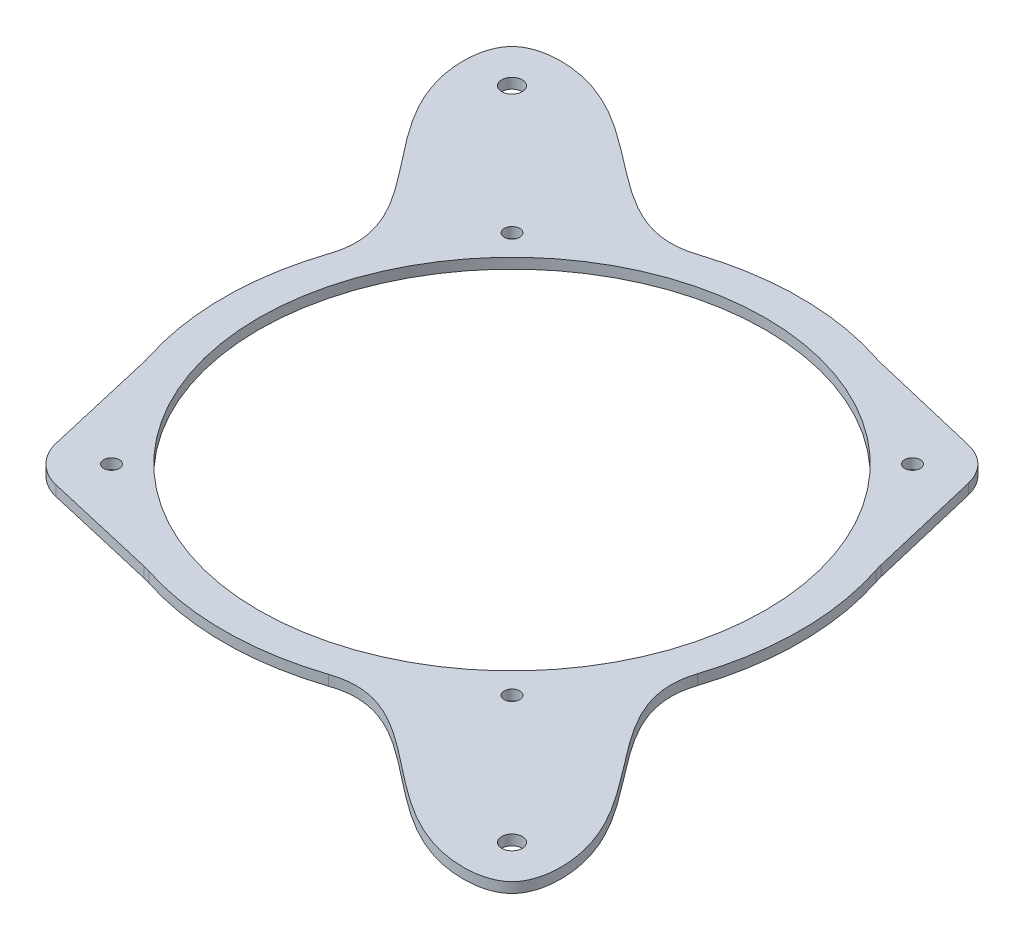
ISO-10303-21;
HEADER;
FILE_DESCRIPTION(('STEP AP214'),'2;1');
FILE_NAME('part.step','',(''),(''),'','','');
FILE_SCHEMA(('AUTOMOTIVE_DESIGN { 1 0 10303 214 1 1 1 1 }'));
ENDSEC;
DATA;
#1=APPLICATION_CONTEXT('core data for automotive mechanical design processes');
#2=APPLICATION_PROTOCOL_DEFINITION('international standard','automotive_design',2000,#1);
#3=PRODUCT_CONTEXT('',#1,'mechanical');
#4=PRODUCT('Part','Part','',(#3));
#5=PRODUCT_RELATED_PRODUCT_CATEGORY('part','',(#4));
#6=PRODUCT_DEFINITION_FORMATION('','',#4);
#7=PRODUCT_DEFINITION_CONTEXT('part definition',#1,'design');
#8=PRODUCT_DEFINITION('design','',#6,#7);
#9=PRODUCT_DEFINITION_SHAPE('','',#8);
#10=(LENGTH_UNIT() NAMED_UNIT(*) SI_UNIT(.MILLI.,.METRE.));
#11=(NAMED_UNIT(*) PLANE_ANGLE_UNIT() SI_UNIT($,.RADIAN.));
#12=(NAMED_UNIT(*) SI_UNIT($,.STERADIAN.) SOLID_ANGLE_UNIT());
#13=UNCERTAINTY_MEASURE_WITH_UNIT(LENGTH_MEASURE(1.E-05),#10,'distance_accuracy_value','');
#14=(GEOMETRIC_REPRESENTATION_CONTEXT(3) GLOBAL_UNCERTAINTY_ASSIGNED_CONTEXT((#13)) GLOBAL_UNIT_ASSIGNED_CONTEXT((#10,
#11,#12)) REPRESENTATION_CONTEXT('',''));
#15=CARTESIAN_POINT('',(0.,0.,0.));
#16=DIRECTION('',(0.,0.,1.));
#17=DIRECTION('',(1.,0.,0.));
#18=AXIS2_PLACEMENT_3D('',#15,#16,#17);
#19=CARTESIAN_POINT('',(-70.2141178406785,2.,-70.2565129555171));
#20=DIRECTION('',(0.,-1.,0.));
#21=DIRECTION('',(0.,0.,-1.));
#22=AXIS2_PLACEMENT_3D('',#19,#20,#21);
#23=PLANE('',#22);
#24=CARTESIAN_POINT('',(-17.2241664621327,2.,-53.2853459187818));
#25=CARTESIAN_POINT('',(-32.1390986115225,2.,-48.3634073784938));
#26=CARTESIAN_POINT('',(-45.2822357571774,2.,-74.6216115278217));
#27=CARTESIAN_POINT('',(-72.088250151005,2.,-72.095595619934));
#28=CARTESIAN_POINT('',(-74.6637270890297,2.,-45.2713033220915));
#29=CARTESIAN_POINT('',(-48.0069801617345,2.,-32.4894658344921));
#30=CARTESIAN_POINT('',(-53.1920044561702,2.,-17.5103015946205));
#31=B_SPLINE_CURVE_WITH_KNOTS('',3,(#24,#25,#26,#27,#28,#29,#30),.UNSPECIFIED.,.F.,.F.,(4,1,1,1,
4),(0.,0.409946781125117,0.50028408857091,0.590621396016702,1.),.UNSPECIFIED.);
#32=CARTESIAN_POINT('',(-17.224166462132,2.,-53.285345918782));
#33=VERTEX_POINT('',#32);
#34=CARTESIAN_POINT('',(-53.1920044561713,2.,-17.5103015946212));
#35=VERTEX_POINT('',#34);
#36=EDGE_CURVE('E244',#33,#35,#31,.T.);
#37=ORIENTED_EDGE('',*,*,#36,.T.);
#38=CARTESIAN_POINT('',(3.88578058618805E-13,2.,3.85108611666851E-13));
#39=DIRECTION('',(0.,1.,0.));
#40=DIRECTION('',(0.,0.,1.));
#41=AXIS2_PLACEMENT_3D('',#38,#39,#40);
#42=CIRCLE('',#41,55.9999999999999);
#43=CARTESIAN_POINT('',(-53.2853459187858,2.,17.2241664621337));
#44=VERTEX_POINT('',#43);
#45=EDGE_CURVE('E127',#35,#44,#42,.T.);
#46=ORIENTED_EDGE('',*,*,#45,.T.);
#47=CARTESIAN_POINT('',(-68.5097304670106,2.,22.145356879886));
#48=DIRECTION('',(0.,-1.,0.));
#49=DIRECTION('',(0.,0.,1.));
#50=AXIS2_PLACEMENT_3D('',#47,#48,#49);
#51=CIRCLE('',#50,16.0000000000001);
#52=CARTESIAN_POINT('',(-52.9221194930763,2.,18.5361486391101));
#53=VERTEX_POINT('',#52);
#54=EDGE_CURVE('E289',#44,#53,#51,.T.);
#55=ORIENTED_EDGE('',*,*,#54,.T.);
#56=DIRECTION('',(0.225575515048493,0.,0.974225685870891));
#57=VECTOR('',#56,1.);
#58=CARTESIAN_POINT('',(-47.7632742489976,2.,40.8164016405666));
#59=LINE('',#58,#57);
#60=CARTESIAN_POINT('',(-47.7632742489976,2.,40.8164016405666));
#61=VERTEX_POINT('',#60);
#62=EDGE_CURVE('E306',#53,#61,#59,.T.);
#63=ORIENTED_EDGE('',*,*,#62,.T.);
#64=CARTESIAN_POINT('',(-38.9952430761602,2.,38.7862220051302));
#65=DIRECTION('',(0.,1.,0.));
#66=DIRECTION('',(0.,0.,1.));
#67=AXIS2_PLACEMENT_3D('',#64,#65,#66);
#68=CIRCLE('',#67,8.99999999999942);
#69=CARTESIAN_POINT('',(-45.253835364579,2.,45.2538353645801));
#70=VERTEX_POINT('',#69);
#71=EDGE_CURVE('E303',#61,#70,#68,.T.);
#72=ORIENTED_EDGE('',*,*,#71,.T.);
#73=CARTESIAN_POINT('',(-38.7862220051291,2.,38.9952430761613));
#74=DIRECTION('',(0.,1.,0.));
#75=DIRECTION('',(0.,0.,-1.));
#76=AXIS2_PLACEMENT_3D('',#73,#74,#75);
#77=CIRCLE('',#76,8.99999999999942);
#78=CARTESIAN_POINT('',(-40.8164016405654,2.,47.7632742489988));
#79=VERTEX_POINT('',#78);
#80=EDGE_CURVE('E305',#70,#79,#77,.T.);
#81=ORIENTED_EDGE('',*,*,#80,.T.);
#82=DIRECTION('',(0.974225685870891,0.,0.225575515048493));
#83=VECTOR('',#82,1.);
#84=CARTESIAN_POINT('',(-40.8164016405654,2.,47.7632742489988));
#85=LINE('',#84,#83);
#86=CARTESIAN_POINT('',(-18.536148639109,2.,52.9221194930774));
#87=VERTEX_POINT('',#86);
#88=EDGE_CURVE('E308',#79,#87,#85,.T.);
#89=ORIENTED_EDGE('',*,*,#88,.T.);
#90=CARTESIAN_POINT('',(-22.1453568798849,2.,68.5097304670117));
#91=DIRECTION('',(0.,-1.,0.));
#92=DIRECTION('',(0.,0.,-1.));
#93=AXIS2_PLACEMENT_3D('',#90,#91,#92);
#94=CIRCLE('',#93,16.0000000000001);
#95=CARTESIAN_POINT('',(-17.2241664621326,2.,53.2853459187871));
#96=VERTEX_POINT('',#95);
#97=EDGE_CURVE('E314',#87,#96,#94,.T.);
#98=ORIENTED_EDGE('',*,*,#97,.T.);
#99=CARTESIAN_POINT('',(3.88578058618805E-13,2.,3.85108611666851E-13));
#100=DIRECTION('',(0.,1.,0.));
#101=DIRECTION('',(0.,0.,-1.));
#102=AXIS2_PLACEMENT_3D('',#99,#100,#101);
#103=CIRCLE('',#102,56.0000000000003);
#104=CARTESIAN_POINT('',(17.5103015946222,2.,53.1920044561725));
#105=VERTEX_POINT('',#104);
#106=EDGE_CURVE('E316',#96,#105,#103,.T.);
#107=ORIENTED_EDGE('',*,*,#106,.T.);
#108=CARTESIAN_POINT('',(17.5103015946222,2.,53.1920044561725));
#109=CARTESIAN_POINT('',(32.4894658344866,2.,48.0069801617142));
#110=CARTESIAN_POINT('',(45.2713033220947,2.,74.6637270890334));
#111=CARTESIAN_POINT('',(72.0955956199341,2.,72.0882501510056));
#112=CARTESIAN_POINT('',(74.6216115278321,2.,45.2822357571819));
#113=CARTESIAN_POINT('',(48.3634073783989,2.,32.1390986114927));
#114=CARTESIAN_POINT('',(53.2853459187841,2.,17.2241664621344));
#115=B_SPLINE_CURVE_WITH_KNOTS('',3,(#108,#109,#110,#111,#112,#113,#114),.UNSPECIFIED.,.F.,.F.,
(4,1,1,1,4),(0.,0.409378603983297,0.49971591142909,0.590053218874883,1.),.UNSPECIFIED.);
#116=CARTESIAN_POINT('',(53.2853459187831,2.,17.2241664621332));
#117=VERTEX_POINT('',#116);
#118=EDGE_CURVE('E318',#105,#117,#115,.T.);
#119=ORIENTED_EDGE('',*,*,#118,.T.);
#120=CARTESIAN_POINT('',(3.88578058618805E-13,2.,3.85108611666851E-13));
#121=DIRECTION('',(0.,1.,0.));
#122=DIRECTION('',(0.,0.,-1.));
#123=AXIS2_PLACEMENT_3D('',#120,#121,#122);
#124=CIRCLE('',#123,55.9999999999964);
#125=CARTESIAN_POINT('',(53.1920044561682,2.,-17.5103015946187));
#126=VERTEX_POINT('',#125);
#127=EDGE_CURVE('E323',#117,#126,#124,.T.);
#128=ORIENTED_EDGE('',*,*,#127,.T.);
#129=CARTESIAN_POINT('',(68.3897200150744,2.,-22.5132449073677));
#130=DIRECTION('',(0.,-1.,0.));
#131=DIRECTION('',(0.,0.,-1.));
#132=AXIS2_PLACEMENT_3D('',#129,#130,#131);
#133=CIRCLE('',#132,15.9999999999999);
#134=CARTESIAN_POINT('',(52.8217319837804,2.,-18.820312650003));
#135=VERTEX_POINT('',#134);
#136=EDGE_CURVE('E414',#126,#135,#133,.T.);
#137=ORIENTED_EDGE('',*,*,#136,.T.);
#138=DIRECTION('',(-0.230808266085289,0.,-0.97299925195588));
#139=VECTOR('',#138,1.);
#140=CARTESIAN_POINT('',(52.8217319837804,2.,-18.820312650003));
#141=LINE('',#140,#139);
#142=CARTESIAN_POINT('',(47.5432152727266,2.,-41.0725174709259));
#143=VERTEX_POINT('',#142);
#144=EDGE_CURVE('E406',#135,#143,#141,.T.);
#145=ORIENTED_EDGE('',*,*,#144,.T.);
#146=CARTESIAN_POINT('',(38.7862220051243,2.,-38.9952430761583));
#147=DIRECTION('',(0.,1.,0.));
#148=DIRECTION('',(0.,0.,-1.));
#149=AXIS2_PLACEMENT_3D('',#146,#147,#148);
#150=CIRCLE('',#149,8.99999999999942);
#151=CARTESIAN_POINT('',(45.2538353645762,2.,-45.253835364575));
#152=VERTEX_POINT('',#151);
#153=EDGE_CURVE('E411',#143,#152,#150,.T.);
#154=ORIENTED_EDGE('',*,*,#153,.T.);
#155=CARTESIAN_POINT('',(38.9952430761595,2.,-38.7862220051232));
#156=DIRECTION('',(0.,1.,0.));
#157=DIRECTION('',(0.,0.,1.));
#158=AXIS2_PLACEMENT_3D('',#155,#156,#157);
#159=CIRCLE('',#158,8.9999999999994);
#160=CARTESIAN_POINT('',(41.072517470927,2.,-47.5432152727255));
#161=VERTEX_POINT('',#160);
#162=EDGE_CURVE('E177',#152,#161,#159,.T.);
#163=ORIENTED_EDGE('',*,*,#162,.T.);
#164=DIRECTION('',(-0.97299925195588,0.,-0.230808266085289));
#165=VECTOR('',#164,1.);
#166=CARTESIAN_POINT('',(18.8203126500042,2.,-52.8217319837792));
#167=LINE('',#166,#165);
#168=CARTESIAN_POINT('',(18.8203126500042,2.,-52.8217319837792));
#169=VERTEX_POINT('',#168);
#170=EDGE_CURVE('E170',#161,#169,#167,.T.);
#171=ORIENTED_EDGE('',*,*,#170,.T.);
#172=CARTESIAN_POINT('',(22.5132449073689,2.,-68.3897200150733));
#173=DIRECTION('',(0.,-1.,0.));
#174=DIRECTION('',(0.,0.,1.));
#175=AXIS2_PLACEMENT_3D('',#172,#173,#174);
#176=CIRCLE('',#175,16.);
#177=CARTESIAN_POINT('',(17.5103015946199,2.,-53.1920044561671));
#178=VERTEX_POINT('',#177);
#179=EDGE_CURVE('E174',#169,#178,#176,.T.);
#180=ORIENTED_EDGE('',*,*,#179,.T.);
#181=CARTESIAN_POINT('',(-2.29687533889309E-12,2.,4.40669160380655E-12));
#182=DIRECTION('',(0.,1.,0.));
#183=DIRECTION('',(0.,0.,1.));
#184=AXIS2_PLACEMENT_3D('',#181,#182,#183);
#185=CIRCLE('',#184,56.);
#186=EDGE_CURVE('E56',#178,#33,#185,.T.);
#187=ORIENTED_EDGE('',*,*,#186,.T.);
#188=EDGE_LOOP('',(#37,#46,#55,#63,#72,#81,#89,#98,#107,#119,#128,#137,#145,#154,#163,#171,#180,#187));
#189=FACE_BOUND('',#188,.T.);
#190=CARTESIAN_POINT('',(-38.8906999999993,2.,-38.8906999999996));
#191=DIRECTION('',(0.,1.,0.));
#192=DIRECTION('',(0.,0.,1.));
#193=AXIS2_PLACEMENT_3D('',#190,#191,#192);
#194=CIRCLE('',#193,1.5);
#195=CARTESIAN_POINT('',(-38.8906999999993,2.,-37.3906999999996));
#196=VERTEX_POINT('',#195);
#197=EDGE_CURVE('E203',#196,#196,#194,.T.);
#198=ORIENTED_EDGE('',*,*,#197,.F.);
#199=EDGE_LOOP('',(#198));
#200=FACE_BOUND('',#199,.T.);
#201=CARTESIAN_POINT('',(38.8907000000007,2.,-38.8906999999996));
#202=DIRECTION('',(0.,1.,0.));
#203=DIRECTION('',(0.,0.,-1.));
#204=AXIS2_PLACEMENT_3D('',#201,#202,#203);
#205=CIRCLE('',#204,1.5);
#206=CARTESIAN_POINT('',(38.8907000000007,2.,-40.3906999999996));
#207=VERTEX_POINT('',#206);
#208=EDGE_CURVE('E442',#207,#207,#205,.T.);
#209=ORIENTED_EDGE('',*,*,#208,.F.);
#210=EDGE_LOOP('',(#209));
#211=FACE_BOUND('',#210,.T.);
#212=CARTESIAN_POINT('',(38.8907000000007,2.,38.8907000000005));
#213=DIRECTION('',(0.,1.,0.));
#214=DIRECTION('',(0.,0.,1.));
#215=AXIS2_PLACEMENT_3D('',#212,#213,#214);
#216=CIRCLE('',#215,1.5);
#217=CARTESIAN_POINT('',(38.8907000000007,2.,40.3907000000005));
#218=VERTEX_POINT('',#217);
#219=EDGE_CURVE('E448',#218,#218,#216,.T.);
#220=ORIENTED_EDGE('',*,*,#219,.F.);
#221=EDGE_LOOP('',(#220));
#222=FACE_BOUND('',#221,.T.);
#223=CARTESIAN_POINT('',(-38.8906999999993,2.,38.8907000000005));
#224=DIRECTION('',(0.,1.,0.));
#225=DIRECTION('',(0.,0.,-1.));
#226=AXIS2_PLACEMENT_3D('',#223,#224,#225);
#227=CIRCLE('',#226,1.5);
#228=CARTESIAN_POINT('',(-38.8906999999993,2.,37.3907000000005));
#229=VERTEX_POINT('',#228);
#230=EDGE_CURVE('E454',#229,#229,#227,.T.);
#231=ORIENTED_EDGE('',*,*,#230,.F.);
#232=EDGE_LOOP('',(#231));
#233=FACE_BOUND('',#232,.T.);
#234=CARTESIAN_POINT('',(-63.6396103067886,2.,-63.6396103067888));
#235=DIRECTION('',(0.,1.,0.));
#236=DIRECTION('',(0.,0.,1.));
#237=AXIS2_PLACEMENT_3D('',#234,#235,#236);
#238=CIRCLE('',#237,2.);
#239=CARTESIAN_POINT('',(-63.6396103067886,2.,-61.6396103067888));
#240=VERTEX_POINT('',#239);
#241=EDGE_CURVE('E460',#240,#240,#238,.T.);
#242=ORIENTED_EDGE('',*,*,#241,.F.);
#243=EDGE_LOOP('',(#242));
#244=FACE_BOUND('',#243,.T.);
#245=CARTESIAN_POINT('',(63.63961030679,2.,63.6396103067897));
#246=DIRECTION('',(0.,1.,0.));
#247=DIRECTION('',(0.,0.,-1.));
#248=AXIS2_PLACEMENT_3D('',#245,#246,#247);
#249=CIRCLE('',#248,2.00000000000001);
#250=CARTESIAN_POINT('',(63.63961030679,2.,61.6396103067897));
#251=VERTEX_POINT('',#250);
#252=EDGE_CURVE('E466',#251,#251,#249,.T.);
#253=ORIENTED_EDGE('',*,*,#252,.F.);
#254=EDGE_LOOP('',(#253));
#255=FACE_BOUND('',#254,.T.);
#256=CARTESIAN_POINT('',(-2.29687533889309E-12,2.,4.40669160380655E-12));
#257=DIRECTION('',(0.,1.,0.));
#258=DIRECTION('',(0.,0.,1.));
#259=AXIS2_PLACEMENT_3D('',#256,#257,#258);
#260=CIRCLE('',#259,49.2);
#261=CARTESIAN_POINT('',(-2.29687533889309E-12,2.,49.2000000000044));
#262=VERTEX_POINT('',#261);
#263=EDGE_CURVE('E472',#262,#262,#260,.T.);
#264=ORIENTED_EDGE('',*,*,#263,.F.);
#265=EDGE_LOOP('',(#264));
#266=FACE_BOUND('',#265,.T.);
#267=ADVANCED_FACE('F38',(#189,#200,#211,#222,#233,#244,#255,#266),#23,.F.);
#268=CARTESIAN_POINT('',(-70.2141178406785,0.,-70.2565129555171));
#269=DIRECTION('',(0.,-1.,0.));
#270=DIRECTION('',(0.,0.,-1.));
#271=AXIS2_PLACEMENT_3D('',#268,#269,#270);
#272=PLANE('',#271);
#273=CARTESIAN_POINT('',(63.63961030679,0.,63.6396103067897));
#274=DIRECTION('',(0.,1.,0.));
#275=DIRECTION('',(0.,0.,-1.));
#276=AXIS2_PLACEMENT_3D('',#273,#274,#275);
#277=CIRCLE('',#276,2.00000000000001);
#278=CARTESIAN_POINT('',(63.63961030679,0.,61.6396103067897));
#279=VERTEX_POINT('',#278);
#280=EDGE_CURVE('E469',#279,#279,#277,.T.);
#281=ORIENTED_EDGE('',*,*,#280,.T.);
#282=EDGE_LOOP('',(#281));
#283=FACE_BOUND('',#282,.T.);
#284=CARTESIAN_POINT('',(-38.8906999999993,0.,38.8907000000005));
#285=DIRECTION('',(0.,1.,0.));
#286=DIRECTION('',(0.,0.,-1.));
#287=AXIS2_PLACEMENT_3D('',#284,#285,#286);
#288=CIRCLE('',#287,1.5);
#289=CARTESIAN_POINT('',(-38.8906999999993,0.,37.3907000000005));
#290=VERTEX_POINT('',#289);
#291=EDGE_CURVE('E457',#290,#290,#288,.T.);
#292=ORIENTED_EDGE('',*,*,#291,.T.);
#293=EDGE_LOOP('',(#292));
#294=FACE_BOUND('',#293,.T.);
#295=CARTESIAN_POINT('',(38.8907000000007,0.,-38.8906999999996));
#296=DIRECTION('',(0.,1.,0.));
#297=DIRECTION('',(0.,0.,-1.));
#298=AXIS2_PLACEMENT_3D('',#295,#296,#297);
#299=CIRCLE('',#298,1.5);
#300=CARTESIAN_POINT('',(38.8907000000007,0.,-40.3906999999996));
#301=VERTEX_POINT('',#300);
#302=EDGE_CURVE('E445',#301,#301,#299,.T.);
#303=ORIENTED_EDGE('',*,*,#302,.T.);
#304=EDGE_LOOP('',(#303));
#305=FACE_BOUND('',#304,.T.);
#306=CARTESIAN_POINT('',(-17.2241664621327,0.,-53.2853459187818));
#307=CARTESIAN_POINT('',(-32.1390986115225,0.,-48.3634073784938));
#308=CARTESIAN_POINT('',(-45.2822357571774,0.,-74.6216115278217));
#309=CARTESIAN_POINT('',(-72.088250151005,0.,-72.095595619934));
#310=CARTESIAN_POINT('',(-74.6637270890297,0.,-45.2713033220915));
#311=CARTESIAN_POINT('',(-48.0069801617345,0.,-32.4894658344921));
#312=CARTESIAN_POINT('',(-53.1920044561702,0.,-17.5103015946205));
#313=B_SPLINE_CURVE_WITH_KNOTS('',3,(#306,#307,#308,#309,#310,#311,#312),.UNSPECIFIED.,.F.,.F.,
(4,1,1,1,4),(0.,0.409946781125117,0.50028408857091,0.590621396016702,1.),.UNSPECIFIED.);
#314=CARTESIAN_POINT('',(-17.224166462132,0.,-53.285345918782));
#315=VERTEX_POINT('',#314);
#316=CARTESIAN_POINT('',(-53.1920044561713,0.,-17.5103015946212));
#317=VERTEX_POINT('',#316);
#318=EDGE_CURVE('E197',#315,#317,#313,.T.);
#319=ORIENTED_EDGE('',*,*,#318,.F.);
#320=CARTESIAN_POINT('',(3.88578058618805E-13,0.,3.85108611666851E-13));
#321=DIRECTION('',(0.,1.,0.));
#322=DIRECTION('',(0.,0.,1.));
#323=AXIS2_PLACEMENT_3D('',#320,#321,#322);
#324=CIRCLE('',#323,55.999999999996);
#325=CARTESIAN_POINT('',(17.5103015946199,0.,-53.1920044561671));
#326=VERTEX_POINT('',#325);
#327=EDGE_CURVE('E115',#326,#315,#324,.T.);
#328=ORIENTED_EDGE('',*,*,#327,.F.);
#329=CARTESIAN_POINT('',(22.5132449073689,0.,-68.3897200150733));
#330=DIRECTION('',(0.,-1.,0.));
#331=DIRECTION('',(0.,0.,1.));
#332=AXIS2_PLACEMENT_3D('',#329,#330,#331);
#333=CIRCLE('',#332,16.);
#334=CARTESIAN_POINT('',(18.8203126500042,0.,-52.8217319837792));
#335=VERTEX_POINT('',#334);
#336=EDGE_CURVE('E241',#335,#326,#333,.T.);
#337=ORIENTED_EDGE('',*,*,#336,.F.);
#338=DIRECTION('',(-0.97299925195588,0.,-0.230808266085289));
#339=VECTOR('',#338,1.);
#340=CARTESIAN_POINT('',(18.8203126500042,0.,-52.8217319837792));
#341=LINE('',#340,#339);
#342=CARTESIAN_POINT('',(41.072517470927,0.,-47.5432152727255));
#343=VERTEX_POINT('',#342);
#344=EDGE_CURVE('E186',#343,#335,#341,.T.);
#345=ORIENTED_EDGE('',*,*,#344,.F.);
#346=CARTESIAN_POINT('',(38.9952430761595,0.,-38.7862220051232));
#347=DIRECTION('',(0.,1.,0.));
#348=DIRECTION('',(0.,0.,1.));
#349=AXIS2_PLACEMENT_3D('',#346,#347,#348);
#350=CIRCLE('',#349,8.9999999999994);
#351=CARTESIAN_POINT('',(45.2538353645762,0.,-45.253835364575));
#352=VERTEX_POINT('',#351);
#353=EDGE_CURVE('E238',#352,#343,#350,.T.);
#354=ORIENTED_EDGE('',*,*,#353,.F.);
#355=CARTESIAN_POINT('',(38.7862220051243,0.,-38.9952430761583));
#356=DIRECTION('',(0.,1.,0.));
#357=DIRECTION('',(0.,0.,-1.));
#358=AXIS2_PLACEMENT_3D('',#355,#356,#357);
#359=CIRCLE('',#358,8.99999999999942);
#360=CARTESIAN_POINT('',(47.5432152727266,0.,-41.0725174709259));
#361=VERTEX_POINT('',#360);
#362=EDGE_CURVE('E236',#361,#352,#359,.T.);
#363=ORIENTED_EDGE('',*,*,#362,.F.);
#364=DIRECTION('',(-0.230808266085289,0.,-0.97299925195588));
#365=VECTOR('',#364,1.);
#366=CARTESIAN_POINT('',(52.8217319837804,0.,-18.820312650003));
#367=LINE('',#366,#365);
#368=CARTESIAN_POINT('',(52.8217319837804,0.,-18.820312650003));
#369=VERTEX_POINT('',#368);
#370=EDGE_CURVE('E234',#369,#361,#367,.T.);
#371=ORIENTED_EDGE('',*,*,#370,.F.);
#372=CARTESIAN_POINT('',(68.3897200150744,0.,-22.5132449073677));
#373=DIRECTION('',(0.,-1.,0.));
#374=DIRECTION('',(0.,0.,-1.));
#375=AXIS2_PLACEMENT_3D('',#372,#373,#374);
#376=CIRCLE('',#375,15.9999999999999);
#377=CARTESIAN_POINT('',(53.1920044561682,0.,-17.5103015946187));
#378=VERTEX_POINT('',#377);
#379=EDGE_CURVE('E232',#378,#369,#376,.T.);
#380=ORIENTED_EDGE('',*,*,#379,.F.);
#381=CARTESIAN_POINT('',(-2.29687533889309E-12,0.,4.40669160380655E-12));
#382=DIRECTION('',(0.,1.,0.));
#383=DIRECTION('',(0.,0.,-1.));
#384=AXIS2_PLACEMENT_3D('',#381,#382,#383);
#385=CIRCLE('',#384,55.9999999999992);
#386=CARTESIAN_POINT('',(53.2853459187831,0.,17.2241664621332));
#387=VERTEX_POINT('',#386);
#388=EDGE_CURVE('E227',#387,#378,#385,.T.);
#389=ORIENTED_EDGE('',*,*,#388,.F.);
#390=CARTESIAN_POINT('',(17.5103015946222,0.,53.1920044561725));
#391=CARTESIAN_POINT('',(32.4894658344866,0.,48.0069801617142));
#392=CARTESIAN_POINT('',(45.2713033220947,0.,74.6637270890334));
#393=CARTESIAN_POINT('',(72.0955956199341,0.,72.0882501510056));
#394=CARTESIAN_POINT('',(74.6216115278321,0.,45.2822357571819));
#395=CARTESIAN_POINT('',(48.3634073783989,0.,32.1390986114927));
#396=CARTESIAN_POINT('',(53.2853459187841,0.,17.2241664621344));
#397=B_SPLINE_CURVE_WITH_KNOTS('',3,(#390,#391,#392,#393,#394,#395,#396),.UNSPECIFIED.,.F.,.F.,
(4,1,1,1,4),(0.,0.409378603983297,0.49971591142909,0.590053218874883,1.),.UNSPECIFIED.);
#398=CARTESIAN_POINT('',(17.5103015946222,0.,53.1920044561725));
#399=VERTEX_POINT('',#398);
#400=EDGE_CURVE('E222',#399,#387,#397,.T.);
#401=ORIENTED_EDGE('',*,*,#400,.F.);
#402=CARTESIAN_POINT('',(3.88578058618805E-13,0.,3.85108611666851E-13));
#403=DIRECTION('',(0.,1.,0.));
#404=DIRECTION('',(0.,0.,-1.));
#405=AXIS2_PLACEMENT_3D('',#402,#403,#404);
#406=CIRCLE('',#405,56.0000000000003);
#407=CARTESIAN_POINT('',(-17.2241664621326,0.,53.2853459187871));
#408=VERTEX_POINT('',#407);
#409=EDGE_CURVE('E220',#408,#399,#406,.T.);
#410=ORIENTED_EDGE('',*,*,#409,.F.);
#411=CARTESIAN_POINT('',(-22.1453568798849,0.,68.5097304670117));
#412=DIRECTION('',(0.,-1.,0.));
#413=DIRECTION('',(0.,0.,-1.));
#414=AXIS2_PLACEMENT_3D('',#411,#412,#413);
#415=CIRCLE('',#414,16.0000000000001);
#416=CARTESIAN_POINT('',(-18.536148639109,0.,52.9221194930774));
#417=VERTEX_POINT('',#416);
#418=EDGE_CURVE('E218',#417,#408,#415,.T.);
#419=ORIENTED_EDGE('',*,*,#418,.F.);
#420=DIRECTION('',(0.974225685870891,0.,0.225575515048493));
#421=VECTOR('',#420,1.);
#422=CARTESIAN_POINT('',(-40.8164016405654,0.,47.7632742489988));
#423=LINE('',#422,#421);
#424=CARTESIAN_POINT('',(-40.8164016405654,0.,47.7632742489988));
#425=VERTEX_POINT('',#424);
#426=EDGE_CURVE('E216',#425,#417,#423,.T.);
#427=ORIENTED_EDGE('',*,*,#426,.F.);
#428=CARTESIAN_POINT('',(-38.7862220051291,0.,38.9952430761613));
#429=DIRECTION('',(0.,1.,0.));
#430=DIRECTION('',(0.,0.,-1.));
#431=AXIS2_PLACEMENT_3D('',#428,#429,#430);
#432=CIRCLE('',#431,8.99999999999942);
#433=CARTESIAN_POINT('',(-45.253835364579,0.,45.2538353645801));
#434=VERTEX_POINT('',#433);
#435=EDGE_CURVE('E214',#434,#425,#432,.T.);
#436=ORIENTED_EDGE('',*,*,#435,.F.);
#437=CARTESIAN_POINT('',(-38.9952430761602,0.,38.7862220051302));
#438=DIRECTION('',(0.,1.,0.));
#439=DIRECTION('',(0.,0.,1.));
#440=AXIS2_PLACEMENT_3D('',#437,#438,#439);
#441=CIRCLE('',#440,8.99999999999942);
#442=CARTESIAN_POINT('',(-47.7632742489976,0.,40.8164016405666));
#443=VERTEX_POINT('',#442);
#444=EDGE_CURVE('E212',#443,#434,#441,.T.);
#445=ORIENTED_EDGE('',*,*,#444,.F.);
#446=DIRECTION('',(0.225575515048493,0.,0.974225685870891));
#447=VECTOR('',#446,1.);
#448=CARTESIAN_POINT('',(-47.7632742489976,0.,40.8164016405666));
#449=LINE('',#448,#447);
#450=CARTESIAN_POINT('',(-52.9221194930763,0.,18.5361486391101));
#451=VERTEX_POINT('',#450);
#452=EDGE_CURVE('E210',#451,#443,#449,.T.);
#453=ORIENTED_EDGE('',*,*,#452,.F.);
#454=CARTESIAN_POINT('',(-68.5097304670106,0.,22.145356879886));
#455=DIRECTION('',(0.,-1.,0.));
#456=DIRECTION('',(0.,0.,1.));
#457=AXIS2_PLACEMENT_3D('',#454,#455,#456);
#458=CIRCLE('',#457,16.0000000000001);
#459=CARTESIAN_POINT('',(-53.2853459187858,0.,17.2241664621337));
#460=VERTEX_POINT('',#459);
#461=EDGE_CURVE('E208',#460,#451,#458,.T.);
#462=ORIENTED_EDGE('',*,*,#461,.F.);
#463=CARTESIAN_POINT('',(3.88578058618805E-13,0.,3.85108611666851E-13));
#464=DIRECTION('',(0.,1.,0.));
#465=DIRECTION('',(0.,0.,1.));
#466=AXIS2_PLACEMENT_3D('',#463,#464,#465);
#467=CIRCLE('',#466,55.9999999999999);
#468=EDGE_CURVE('E202',#317,#460,#467,.T.);
#469=ORIENTED_EDGE('',*,*,#468,.F.);
#470=EDGE_LOOP('',(#319,#328,#337,#345,#354,#363,#371,#380,#389,#401,#410,#419,#427,#436,#445,
#453,#462,#469));
#471=FACE_BOUND('',#470,.T.);
#472=CARTESIAN_POINT('',(-38.8906999999993,0.,-38.8906999999996));
#473=DIRECTION('',(0.,1.,0.));
#474=DIRECTION('',(0.,0.,1.));
#475=AXIS2_PLACEMENT_3D('',#472,#473,#474);
#476=CIRCLE('',#475,1.5);
#477=CARTESIAN_POINT('',(-38.8906999999993,0.,-37.3906999999996));
#478=VERTEX_POINT('',#477);
#479=EDGE_CURVE('E436',#478,#478,#476,.T.);
#480=ORIENTED_EDGE('',*,*,#479,.T.);
#481=EDGE_LOOP('',(#480));
#482=FACE_BOUND('',#481,.T.);
#483=CARTESIAN_POINT('',(38.8907000000007,0.,38.8907000000005));
#484=DIRECTION('',(0.,1.,0.));
#485=DIRECTION('',(0.,0.,1.));
#486=AXIS2_PLACEMENT_3D('',#483,#484,#485);
#487=CIRCLE('',#486,1.5);
#488=CARTESIAN_POINT('',(38.8907000000007,0.,40.3907000000005));
#489=VERTEX_POINT('',#488);
#490=EDGE_CURVE('E451',#489,#489,#487,.T.);
#491=ORIENTED_EDGE('',*,*,#490,.T.);
#492=EDGE_LOOP('',(#491));
#493=FACE_BOUND('',#492,.T.);
#494=CARTESIAN_POINT('',(-63.6396103067886,0.,-63.6396103067888));
#495=DIRECTION('',(0.,1.,0.));
#496=DIRECTION('',(0.,0.,1.));
#497=AXIS2_PLACEMENT_3D('',#494,#495,#496);
#498=CIRCLE('',#497,2.);
#499=CARTESIAN_POINT('',(-63.6396103067886,0.,-61.6396103067888));
#500=VERTEX_POINT('',#499);
#501=EDGE_CURVE('E463',#500,#500,#498,.T.);
#502=ORIENTED_EDGE('',*,*,#501,.T.);
#503=EDGE_LOOP('',(#502));
#504=FACE_BOUND('',#503,.T.);
#505=CARTESIAN_POINT('',(-2.29687533889309E-12,0.,4.40669160380655E-12));
#506=DIRECTION('',(0.,1.,0.));
#507=DIRECTION('',(0.,0.,1.));
#508=AXIS2_PLACEMENT_3D('',#505,#506,#507);
#509=CIRCLE('',#508,49.2);
#510=CARTESIAN_POINT('',(-2.29687533889309E-12,0.,49.2000000000044));
#511=VERTEX_POINT('',#510);
#512=EDGE_CURVE('E475',#511,#511,#509,.T.);
#513=ORIENTED_EDGE('',*,*,#512,.T.);
#514=EDGE_LOOP('',(#513));
#515=FACE_BOUND('',#514,.T.);
#516=ADVANCED_FACE('F291',(#283,#294,#305,#471,#482,#493,#504,#515),#272,.T.);
#517=DIRECTION('',(0.,-1.,0.));
#518=VECTOR('',#517,1.);
#519=SURFACE_OF_LINEAR_EXTRUSION('',#31,#518);
#520=ORIENTED_EDGE('',*,*,#318,.T.);
#521=DIRECTION('',(0.,-1.,0.));
#522=VECTOR('',#521,1.);
#523=CARTESIAN_POINT('',(-53.1920044561713,2.,-17.5103015946212));
#524=LINE('',#523,#522);
#525=EDGE_CURVE('E11',#35,#317,#524,.T.);
#526=ORIENTED_EDGE('',*,*,#525,.F.);
#527=ORIENTED_EDGE('',*,*,#36,.F.);
#528=DIRECTION('',(0.,-1.,0.));
#529=VECTOR('',#528,1.);
#530=CARTESIAN_POINT('',(-17.224166462132,2.,-53.285345918782));
#531=LINE('',#530,#529);
#532=EDGE_CURVE('E193',#33,#315,#531,.T.);
#533=ORIENTED_EDGE('',*,*,#532,.T.);
#534=EDGE_LOOP('',(#520,#526,#527,#533));
#535=FACE_BOUND('',#534,.T.);
#536=ADVANCED_FACE('F40',(#535),#519,.F.);
#537=CARTESIAN_POINT('',(3.88578058618805E-13,2.,3.85108611666851E-13));
#538=DIRECTION('',(0.,-1.,0.));
#539=DIRECTION('',(0.,0.,-1.));
#540=AXIS2_PLACEMENT_3D('',#537,#538,#539);
#541=CYLINDRICAL_SURFACE('',#540,55.9999999999999);
#542=ORIENTED_EDGE('',*,*,#468,.T.);
#543=DIRECTION('',(0.,-1.,0.));
#544=VECTOR('',#543,1.);
#545=CARTESIAN_POINT('',(-53.2853459187858,2.,17.2241664621337));
#546=LINE('',#545,#544);
#547=EDGE_CURVE('E48',#44,#460,#546,.T.);
#548=ORIENTED_EDGE('',*,*,#547,.F.);
#549=ORIENTED_EDGE('',*,*,#45,.F.);
#550=ORIENTED_EDGE('',*,*,#525,.T.);
#551=EDGE_LOOP('',(#542,#548,#549,#550));
#552=FACE_BOUND('',#551,.T.);
#553=ADVANCED_FACE('F357',(#552),#541,.T.);
#554=CARTESIAN_POINT('',(-68.5097304670106,2.,22.145356879886));
#555=DIRECTION('',(0.,-1.,0.));
#556=DIRECTION('',(0.,0.,-1.));
#557=AXIS2_PLACEMENT_3D('',#554,#555,#556);
#558=CYLINDRICAL_SURFACE('',#557,16.0000000000001);
#559=ORIENTED_EDGE('',*,*,#461,.T.);
#560=DIRECTION('',(0.,-1.,0.));
#561=VECTOR('',#560,1.);
#562=CARTESIAN_POINT('',(-52.9221194930763,2.,18.5361486391101));
#563=LINE('',#562,#561);
#564=EDGE_CURVE('E281',#53,#451,#563,.T.);
#565=ORIENTED_EDGE('',*,*,#564,.F.);
#566=ORIENTED_EDGE('',*,*,#54,.F.);
#567=ORIENTED_EDGE('',*,*,#547,.T.);
#568=EDGE_LOOP('',(#559,#565,#566,#567));
#569=FACE_BOUND('',#568,.T.);
#570=ADVANCED_FACE('F287',(#569),#558,.F.);
#571=CARTESIAN_POINT('',(-47.7632742489976,2.,40.8164016405666));
#572=DIRECTION('',(0.974225685870891,0.,-0.225575515048493));
#573=DIRECTION('',(-0.225575515048493,0.,-0.974225685870891));
#574=AXIS2_PLACEMENT_3D('',#571,#572,#573);
#575=PLANE('',#574);
#576=ORIENTED_EDGE('',*,*,#452,.T.);
#577=DIRECTION('',(0.,-1.,0.));
#578=VECTOR('',#577,1.);
#579=CARTESIAN_POINT('',(-47.7632742489976,2.,40.8164016405666));
#580=LINE('',#579,#578);
#581=EDGE_CURVE('E278',#61,#443,#580,.T.);
#582=ORIENTED_EDGE('',*,*,#581,.F.);
#583=ORIENTED_EDGE('',*,*,#62,.F.);
#584=ORIENTED_EDGE('',*,*,#564,.T.);
#585=EDGE_LOOP('',(#576,#582,#583,#584));
#586=FACE_BOUND('',#585,.T.);
#587=ADVANCED_FACE('F297',(#586),#575,.F.);
#588=CARTESIAN_POINT('',(-38.9952430761602,2.,38.7862220051302));
#589=DIRECTION('',(0.,-1.,0.));
#590=DIRECTION('',(0.,0.,-1.));
#591=AXIS2_PLACEMENT_3D('',#588,#589,#590);
#592=CYLINDRICAL_SURFACE('',#591,8.99999999999942);
#593=ORIENTED_EDGE('',*,*,#444,.T.);
#594=DIRECTION('',(0.,-1.,0.));
#595=VECTOR('',#594,1.);
#596=CARTESIAN_POINT('',(-45.253835364579,2.,45.2538353645801));
#597=LINE('',#596,#595);
#598=EDGE_CURVE('E275',#70,#434,#597,.T.);
#599=ORIENTED_EDGE('',*,*,#598,.F.);
#600=ORIENTED_EDGE('',*,*,#71,.F.);
#601=ORIENTED_EDGE('',*,*,#581,.T.);
#602=EDGE_LOOP('',(#593,#599,#600,#601));
#603=FACE_BOUND('',#602,.T.);
#604=ADVANCED_FACE('F301',(#603),#592,.T.);
#605=CARTESIAN_POINT('',(-38.7862220051291,2.,38.9952430761613));
#606=DIRECTION('',(0.,-1.,0.));
#607=DIRECTION('',(0.,0.,-1.));
#608=AXIS2_PLACEMENT_3D('',#605,#606,#607);
#609=CYLINDRICAL_SURFACE('',#608,8.99999999999942);
#610=ORIENTED_EDGE('',*,*,#435,.T.);
#611=DIRECTION('',(0.,-1.,0.));
#612=VECTOR('',#611,1.);
#613=CARTESIAN_POINT('',(-40.8164016405654,2.,47.7632742489988));
#614=LINE('',#613,#612);
#615=EDGE_CURVE('E272',#79,#425,#614,.T.);
#616=ORIENTED_EDGE('',*,*,#615,.F.);
#617=ORIENTED_EDGE('',*,*,#80,.F.);
#618=ORIENTED_EDGE('',*,*,#598,.T.);
#619=EDGE_LOOP('',(#610,#616,#617,#618));
#620=FACE_BOUND('',#619,.T.);
#621=ADVANCED_FACE('F347',(#620),#609,.T.);
#622=CARTESIAN_POINT('',(-40.8164016405654,2.,47.7632742489988));
#623=DIRECTION('',(0.225575515048493,0.,-0.974225685870891));
#624=DIRECTION('',(-0.974225685870891,0.,-0.225575515048493));
#625=AXIS2_PLACEMENT_3D('',#622,#623,#624);
#626=PLANE('',#625);
#627=ORIENTED_EDGE('',*,*,#426,.T.);
#628=DIRECTION('',(0.,-1.,0.));
#629=VECTOR('',#628,1.);
#630=CARTESIAN_POINT('',(-18.536148639109,2.,52.9221194930774));
#631=LINE('',#630,#629);
#632=EDGE_CURVE('E269',#87,#417,#631,.T.);
#633=ORIENTED_EDGE('',*,*,#632,.F.);
#634=ORIENTED_EDGE('',*,*,#88,.F.);
#635=ORIENTED_EDGE('',*,*,#615,.T.);
#636=EDGE_LOOP('',(#627,#633,#634,#635));
#637=FACE_BOUND('',#636,.T.);
#638=ADVANCED_FACE('F343',(#637),#626,.F.);
#639=CARTESIAN_POINT('',(-22.1453568798849,2.,68.5097304670117));
#640=DIRECTION('',(0.,-1.,0.));
#641=DIRECTION('',(0.,0.,-1.));
#642=AXIS2_PLACEMENT_3D('',#639,#640,#641);
#643=CYLINDRICAL_SURFACE('',#642,16.0000000000001);
#644=ORIENTED_EDGE('',*,*,#418,.T.);
#645=DIRECTION('',(0.,-1.,0.));
#646=VECTOR('',#645,1.);
#647=CARTESIAN_POINT('',(-17.2241664621326,2.,53.2853459187871));
#648=LINE('',#647,#646);
#649=EDGE_CURVE('E266',#96,#408,#648,.T.);
#650=ORIENTED_EDGE('',*,*,#649,.F.);
#651=ORIENTED_EDGE('',*,*,#97,.F.);
#652=ORIENTED_EDGE('',*,*,#632,.T.);
#653=EDGE_LOOP('',(#644,#650,#651,#652));
#654=FACE_BOUND('',#653,.T.);
#655=ADVANCED_FACE('F339',(#654),#643,.F.);
#656=CARTESIAN_POINT('',(3.88578058618805E-13,2.,3.85108611666851E-13));
#657=DIRECTION('',(0.,-1.,0.));
#658=DIRECTION('',(0.,0.,-1.));
#659=AXIS2_PLACEMENT_3D('',#656,#657,#658);
#660=CYLINDRICAL_SURFACE('',#659,56.0000000000003);
#661=ORIENTED_EDGE('',*,*,#409,.T.);
#662=DIRECTION('',(0.,-1.,0.));
#663=VECTOR('',#662,1.);
#664=CARTESIAN_POINT('',(17.5103015946222,2.,53.1920044561725));
#665=LINE('',#664,#663);
#666=EDGE_CURVE('E263',#105,#399,#665,.T.);
#667=ORIENTED_EDGE('',*,*,#666,.F.);
#668=ORIENTED_EDGE('',*,*,#106,.F.);
#669=ORIENTED_EDGE('',*,*,#649,.T.);
#670=EDGE_LOOP('',(#661,#667,#668,#669));
#671=FACE_BOUND('',#670,.T.);
#672=ADVANCED_FACE('F334',(#671),#660,.T.);
#673=DIRECTION('',(0.,-1.,0.));
#674=VECTOR('',#673,1.);
#675=SURFACE_OF_LINEAR_EXTRUSION('',#115,#674);
#676=ORIENTED_EDGE('',*,*,#400,.T.);
#677=DIRECTION('',(0.,-1.,0.));
#678=VECTOR('',#677,1.);
#679=CARTESIAN_POINT('',(53.2853459187831,2.,17.2241664621332));
#680=LINE('',#679,#678);
#681=EDGE_CURVE('E260',#117,#387,#680,.T.);
#682=ORIENTED_EDGE('',*,*,#681,.F.);
#683=ORIENTED_EDGE('',*,*,#118,.F.);
#684=ORIENTED_EDGE('',*,*,#666,.T.);
#685=EDGE_LOOP('',(#676,#682,#683,#684));
#686=FACE_BOUND('',#685,.T.);
#687=ADVANCED_FACE('F329',(#686),#675,.F.);
#688=CARTESIAN_POINT('',(-2.29687533889309E-12,2.,4.40669160380655E-12));
#689=DIRECTION('',(0.,-1.,0.));
#690=DIRECTION('',(0.,0.,-1.));
#691=AXIS2_PLACEMENT_3D('',#688,#689,#690);
#692=CYLINDRICAL_SURFACE('',#691,55.9999999999992);
#693=ORIENTED_EDGE('',*,*,#388,.T.);
#694=DIRECTION('',(0.,-1.,0.));
#695=VECTOR('',#694,1.);
#696=CARTESIAN_POINT('',(53.1920044561682,2.,-17.5103015946187));
#697=LINE('',#696,#695);
#698=EDGE_CURVE('E257',#126,#378,#697,.T.);
#699=ORIENTED_EDGE('',*,*,#698,.F.);
#700=ORIENTED_EDGE('',*,*,#127,.F.);
#701=ORIENTED_EDGE('',*,*,#681,.T.);
#702=EDGE_LOOP('',(#693,#699,#700,#701));
#703=FACE_BOUND('',#702,.T.);
#704=ADVANCED_FACE('F333',(#703),#692,.T.);
#705=CARTESIAN_POINT('',(68.3897200150744,2.,-22.5132449073677));
#706=DIRECTION('',(0.,-1.,0.));
#707=DIRECTION('',(0.,0.,-1.));
#708=AXIS2_PLACEMENT_3D('',#705,#706,#707);
#709=CYLINDRICAL_SURFACE('',#708,15.9999999999999);
#710=ORIENTED_EDGE('',*,*,#379,.T.);
#711=DIRECTION('',(0.,-1.,0.));
#712=VECTOR('',#711,1.);
#713=CARTESIAN_POINT('',(52.8217319837804,2.,-18.820312650003));
#714=LINE('',#713,#712);
#715=EDGE_CURVE('E254',#135,#369,#714,.T.);
#716=ORIENTED_EDGE('',*,*,#715,.F.);
#717=ORIENTED_EDGE('',*,*,#136,.F.);
#718=ORIENTED_EDGE('',*,*,#698,.T.);
#719=EDGE_LOOP('',(#710,#716,#717,#718));
#720=FACE_BOUND('',#719,.T.);
#721=ADVANCED_FACE('F391',(#720),#709,.F.);
#722=CARTESIAN_POINT('',(52.8217319837804,2.,-18.820312650003));
#723=DIRECTION('',(-0.97299925195588,0.,0.230808266085289));
#724=DIRECTION('',(0.230808266085289,0.,0.97299925195588));
#725=AXIS2_PLACEMENT_3D('',#722,#723,#724);
#726=PLANE('',#725);
#727=ORIENTED_EDGE('',*,*,#370,.T.);
#728=DIRECTION('',(0.,-1.,0.));
#729=VECTOR('',#728,1.);
#730=CARTESIAN_POINT('',(47.5432152727266,2.,-41.0725174709259));
#731=LINE('',#730,#729);
#732=EDGE_CURVE('E251',#143,#361,#731,.T.);
#733=ORIENTED_EDGE('',*,*,#732,.F.);
#734=ORIENTED_EDGE('',*,*,#144,.F.);
#735=ORIENTED_EDGE('',*,*,#715,.T.);
#736=EDGE_LOOP('',(#727,#733,#734,#735));
#737=FACE_BOUND('',#736,.T.);
#738=ADVANCED_FACE('F388',(#737),#726,.F.);
#739=CARTESIAN_POINT('',(38.7862220051243,2.,-38.9952430761583));
#740=DIRECTION('',(0.,-1.,0.));
#741=DIRECTION('',(0.,0.,-1.));
#742=AXIS2_PLACEMENT_3D('',#739,#740,#741);
#743=CYLINDRICAL_SURFACE('',#742,8.99999999999942);
#744=ORIENTED_EDGE('',*,*,#362,.T.);
#745=DIRECTION('',(0.,-1.,0.));
#746=VECTOR('',#745,1.);
#747=CARTESIAN_POINT('',(45.2538353645762,2.,-45.253835364575));
#748=LINE('',#747,#746);
#749=EDGE_CURVE('E248',#152,#352,#748,.T.);
#750=ORIENTED_EDGE('',*,*,#749,.F.);
#751=ORIENTED_EDGE('',*,*,#153,.F.);
#752=ORIENTED_EDGE('',*,*,#732,.T.);
#753=EDGE_LOOP('',(#744,#750,#751,#752));
#754=FACE_BOUND('',#753,.T.);
#755=ADVANCED_FACE('F384',(#754),#743,.T.);
#756=CARTESIAN_POINT('',(38.9952430761595,2.,-38.7862220051232));
#757=DIRECTION('',(0.,-1.,0.));
#758=DIRECTION('',(0.,0.,-1.));
#759=AXIS2_PLACEMENT_3D('',#756,#757,#758);
#760=CYLINDRICAL_SURFACE('',#759,8.9999999999994);
#761=ORIENTED_EDGE('',*,*,#353,.T.);
#762=DIRECTION('',(0.,-1.,0.));
#763=VECTOR('',#762,1.);
#764=CARTESIAN_POINT('',(41.072517470927,2.,-47.5432152727255));
#765=LINE('',#764,#763);
#766=EDGE_CURVE('E188',#161,#343,#765,.T.);
#767=ORIENTED_EDGE('',*,*,#766,.F.);
#768=ORIENTED_EDGE('',*,*,#162,.F.);
#769=ORIENTED_EDGE('',*,*,#749,.T.);
#770=EDGE_LOOP('',(#761,#767,#768,#769));
#771=FACE_BOUND('',#770,.T.);
#772=ADVANCED_FACE('F381',(#771),#760,.T.);
#773=CARTESIAN_POINT('',(18.8203126500042,2.,-52.8217319837792));
#774=DIRECTION('',(-0.230808266085289,0.,0.97299925195588));
#775=DIRECTION('',(0.97299925195588,0.,0.230808266085289));
#776=AXIS2_PLACEMENT_3D('',#773,#774,#775);
#777=PLANE('',#776);
#778=ORIENTED_EDGE('',*,*,#344,.T.);
#779=DIRECTION('',(0.,-1.,0.));
#780=VECTOR('',#779,1.);
#781=CARTESIAN_POINT('',(18.8203126500042,2.,-52.8217319837792));
#782=LINE('',#781,#780);
#783=EDGE_CURVE('E183',#169,#335,#782,.T.);
#784=ORIENTED_EDGE('',*,*,#783,.F.);
#785=ORIENTED_EDGE('',*,*,#170,.F.);
#786=ORIENTED_EDGE('',*,*,#766,.T.);
#787=EDGE_LOOP('',(#778,#784,#785,#786));
#788=FACE_BOUND('',#787,.T.);
#789=ADVANCED_FACE('F184',(#788),#777,.F.);
#790=CARTESIAN_POINT('',(22.5132449073689,2.,-68.3897200150733));
#791=DIRECTION('',(0.,-1.,0.));
#792=DIRECTION('',(0.,0.,-1.));
#793=AXIS2_PLACEMENT_3D('',#790,#791,#792);
#794=CYLINDRICAL_SURFACE('',#793,16.);
#795=ORIENTED_EDGE('',*,*,#336,.T.);
#796=DIRECTION('',(0.,-1.,0.));
#797=VECTOR('',#796,1.);
#798=CARTESIAN_POINT('',(17.5103015946199,2.,-53.1920044561671));
#799=LINE('',#798,#797);
#800=EDGE_CURVE('E189',#178,#326,#799,.T.);
#801=ORIENTED_EDGE('',*,*,#800,.F.);
#802=ORIENTED_EDGE('',*,*,#179,.F.);
#803=ORIENTED_EDGE('',*,*,#783,.T.);
#804=EDGE_LOOP('',(#795,#801,#802,#803));
#805=FACE_BOUND('',#804,.T.);
#806=ADVANCED_FACE('F191',(#805),#794,.F.);
#807=CARTESIAN_POINT('',(3.88578058618805E-13,2.,3.85108611666851E-13));
#808=DIRECTION('',(0.,-1.,0.));
#809=DIRECTION('',(0.,0.,-1.));
#810=AXIS2_PLACEMENT_3D('',#807,#808,#809);
#811=CYLINDRICAL_SURFACE('',#810,55.999999999996);
#812=ORIENTED_EDGE('',*,*,#327,.T.);
#813=ORIENTED_EDGE('',*,*,#532,.F.);
#814=ORIENTED_EDGE('',*,*,#186,.F.);
#815=ORIENTED_EDGE('',*,*,#800,.T.);
#816=EDGE_LOOP('',(#812,#813,#814,#815));
#817=FACE_BOUND('',#816,.T.);
#818=ADVANCED_FACE('F374',(#817),#811,.T.);
#819=CARTESIAN_POINT('',(-38.8906999999993,2.,-38.8906999999996));
#820=DIRECTION('',(0.,-1.,0.));
#821=DIRECTION('',(0.,0.,-1.));
#822=AXIS2_PLACEMENT_3D('',#819,#820,#821);
#823=CYLINDRICAL_SURFACE('',#822,1.5);
#824=ORIENTED_EDGE('',*,*,#197,.T.);
#825=EDGE_LOOP('',(#824));
#826=FACE_BOUND('',#825,.T.);
#827=ORIENTED_EDGE('',*,*,#479,.F.);
#828=EDGE_LOOP('',(#827));
#829=FACE_BOUND('',#828,.T.);
#830=ADVANCED_FACE('F371',(#826,#829),#823,.F.);
#831=CARTESIAN_POINT('',(38.8907000000007,2.,-38.8906999999996));
#832=DIRECTION('',(0.,-1.,0.));
#833=DIRECTION('',(0.,0.,-1.));
#834=AXIS2_PLACEMENT_3D('',#831,#832,#833);
#835=CYLINDRICAL_SURFACE('',#834,1.5);
#836=ORIENTED_EDGE('',*,*,#208,.T.);
#837=EDGE_LOOP('',(#836));
#838=FACE_BOUND('',#837,.T.);
#839=ORIENTED_EDGE('',*,*,#302,.F.);
#840=EDGE_LOOP('',(#839));
#841=FACE_BOUND('',#840,.T.);
#842=ADVANCED_FACE('F505',(#838,#841),#835,.F.);
#843=CARTESIAN_POINT('',(38.8907000000007,2.,38.8907000000005));
#844=DIRECTION('',(0.,-1.,0.));
#845=DIRECTION('',(0.,0.,-1.));
#846=AXIS2_PLACEMENT_3D('',#843,#844,#845);
#847=CYLINDRICAL_SURFACE('',#846,1.5);
#848=ORIENTED_EDGE('',*,*,#219,.T.);
#849=EDGE_LOOP('',(#848));
#850=FACE_BOUND('',#849,.T.);
#851=ORIENTED_EDGE('',*,*,#490,.F.);
#852=EDGE_LOOP('',(#851));
#853=FACE_BOUND('',#852,.T.);
#854=ADVANCED_FACE('F502',(#850,#853),#847,.F.);
#855=CARTESIAN_POINT('',(-38.8906999999993,2.,38.8907000000005));
#856=DIRECTION('',(0.,-1.,0.));
#857=DIRECTION('',(0.,0.,-1.));
#858=AXIS2_PLACEMENT_3D('',#855,#856,#857);
#859=CYLINDRICAL_SURFACE('',#858,1.5);
#860=ORIENTED_EDGE('',*,*,#230,.T.);
#861=EDGE_LOOP('',(#860));
#862=FACE_BOUND('',#861,.T.);
#863=ORIENTED_EDGE('',*,*,#291,.F.);
#864=EDGE_LOOP('',(#863));
#865=FACE_BOUND('',#864,.T.);
#866=ADVANCED_FACE('F498',(#862,#865),#859,.F.);
#867=CARTESIAN_POINT('',(-63.6396103067886,2.,-63.6396103067888));
#868=DIRECTION('',(0.,-1.,0.));
#869=DIRECTION('',(0.,0.,-1.));
#870=AXIS2_PLACEMENT_3D('',#867,#868,#869);
#871=CYLINDRICAL_SURFACE('',#870,2.);
#872=ORIENTED_EDGE('',*,*,#241,.T.);
#873=EDGE_LOOP('',(#872));
#874=FACE_BOUND('',#873,.T.);
#875=ORIENTED_EDGE('',*,*,#501,.F.);
#876=EDGE_LOOP('',(#875));
#877=FACE_BOUND('',#876,.T.);
#878=ADVANCED_FACE('F492',(#874,#877),#871,.F.);
#879=CARTESIAN_POINT('',(63.63961030679,2.,63.6396103067897));
#880=DIRECTION('',(0.,-1.,0.));
#881=DIRECTION('',(0.,0.,-1.));
#882=AXIS2_PLACEMENT_3D('',#879,#880,#881);
#883=CYLINDRICAL_SURFACE('',#882,2.00000000000001);
#884=ORIENTED_EDGE('',*,*,#252,.T.);
#885=EDGE_LOOP('',(#884));
#886=FACE_BOUND('',#885,.T.);
#887=ORIENTED_EDGE('',*,*,#280,.F.);
#888=EDGE_LOOP('',(#887));
#889=FACE_BOUND('',#888,.T.);
#890=ADVANCED_FACE('F485',(#886,#889),#883,.F.);
#891=CARTESIAN_POINT('',(-2.29687533889309E-12,2.,4.40669160380655E-12));
#892=DIRECTION('',(0.,-1.,0.));
#893=DIRECTION('',(0.,0.,-1.));
#894=AXIS2_PLACEMENT_3D('',#891,#892,#893);
#895=CYLINDRICAL_SURFACE('',#894,49.2);
#896=ORIENTED_EDGE('',*,*,#263,.T.);
#897=EDGE_LOOP('',(#896));
#898=FACE_BOUND('',#897,.T.);
#899=ORIENTED_EDGE('',*,*,#512,.F.);
#900=EDGE_LOOP('',(#899));
#901=FACE_BOUND('',#900,.T.);
#902=ADVANCED_FACE('F481',(#898,#901),#895,.F.);
#903=CLOSED_SHELL('',(#267,#516,#536,#553,#570,#587,#604,#621,#638,#655,#672,#687,#704,#721,
#738,#755,#772,#789,#806,#818,#830,#842,#854,#866,#878,#890,#902));
#904=MANIFOLD_SOLID_BREP('B2',#903);
#905=ADVANCED_BREP_SHAPE_REPRESENTATION('',(#18,#904),#14);
#906=SHAPE_DEFINITION_REPRESENTATION(#9,#905);
ENDSEC;
END-ISO-10303-21;
